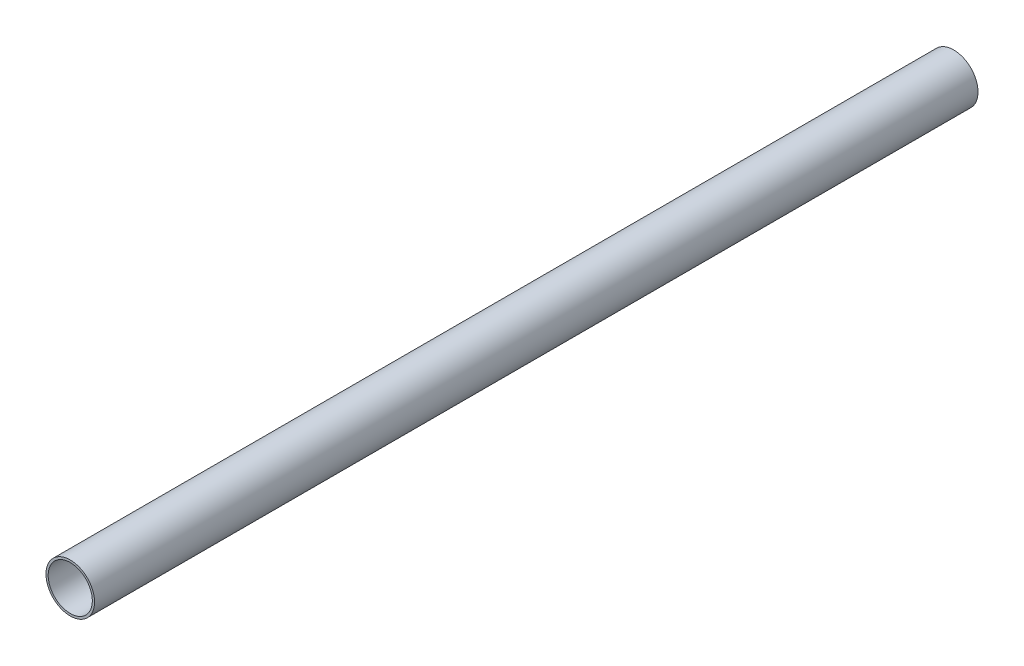
ISO-10303-21;
HEADER;
FILE_DESCRIPTION(('STEP AP214'),'2;1');
FILE_NAME('part.step','',(''),(''),'','','');
FILE_SCHEMA(('AUTOMOTIVE_DESIGN { 1 0 10303 214 1 1 1 1 }'));
ENDSEC;
DATA;
#1=APPLICATION_CONTEXT('core data for automotive mechanical design processes');
#2=APPLICATION_PROTOCOL_DEFINITION('international standard','automotive_design',2000,#1);
#3=PRODUCT_CONTEXT('',#1,'mechanical');
#4=PRODUCT('Part','Part','',(#3));
#5=PRODUCT_RELATED_PRODUCT_CATEGORY('part','',(#4));
#6=PRODUCT_DEFINITION_FORMATION('','',#4);
#7=PRODUCT_DEFINITION_CONTEXT('part definition',#1,'design');
#8=PRODUCT_DEFINITION('design','',#6,#7);
#9=PRODUCT_DEFINITION_SHAPE('','',#8);
#10=(LENGTH_UNIT() NAMED_UNIT(*) SI_UNIT(.MILLI.,.METRE.));
#11=(NAMED_UNIT(*) PLANE_ANGLE_UNIT() SI_UNIT($,.RADIAN.));
#12=(NAMED_UNIT(*) SI_UNIT($,.STERADIAN.) SOLID_ANGLE_UNIT());
#13=UNCERTAINTY_MEASURE_WITH_UNIT(LENGTH_MEASURE(1.E-05),#10,'distance_accuracy_value','');
#14=(GEOMETRIC_REPRESENTATION_CONTEXT(3) GLOBAL_UNCERTAINTY_ASSIGNED_CONTEXT((#13)) GLOBAL_UNIT_ASSIGNED_CONTEXT((#10,
#11,#12)) REPRESENTATION_CONTEXT('',''));
#15=CARTESIAN_POINT('',(0.,0.,0.));
#16=DIRECTION('',(0.,0.,1.));
#17=DIRECTION('',(1.,0.,0.));
#18=AXIS2_PLACEMENT_3D('',#15,#16,#17);
#19=CARTESIAN_POINT('',(0.,0.,690.));
#20=DIRECTION('',(0.,0.,-1.));
#21=DIRECTION('',(-1.,0.,0.));
#22=AXIS2_PLACEMENT_3D('',#19,#20,#21);
#23=CYLINDRICAL_SURFACE('',#22,18.975);
#24=CARTESIAN_POINT('',(0.,0.,690.));
#25=DIRECTION('',(0.,0.,1.));
#26=DIRECTION('',(1.,0.,0.));
#27=AXIS2_PLACEMENT_3D('',#24,#25,#26);
#28=CIRCLE('',#27,18.975);
#29=CARTESIAN_POINT('',(18.975,0.,690.));
#30=VERTEX_POINT('',#29);
#31=EDGE_CURVE('E10',#30,#30,#28,.T.);
#32=ORIENTED_EDGE('',*,*,#31,.F.);
#33=EDGE_LOOP('',(#32));
#34=FACE_BOUND('',#33,.T.);
#35=CARTESIAN_POINT('',(0.,0.,0.));
#36=DIRECTION('',(0.,0.,1.));
#37=DIRECTION('',(1.,0.,0.));
#38=AXIS2_PLACEMENT_3D('',#35,#36,#37);
#39=CIRCLE('',#38,18.975);
#40=CARTESIAN_POINT('',(18.975,0.,0.));
#41=VERTEX_POINT('',#40);
#42=EDGE_CURVE('E34',#41,#41,#39,.T.);
#43=ORIENTED_EDGE('',*,*,#42,.T.);
#44=EDGE_LOOP('',(#43));
#45=FACE_BOUND('',#44,.T.);
#46=ADVANCED_FACE('F31',(#34,#45),#23,.T.);
#47=CARTESIAN_POINT('',(0.,0.,690.));
#48=DIRECTION('',(0.,0.,1.));
#49=DIRECTION('',(1.,0.,0.));
#50=AXIS2_PLACEMENT_3D('',#47,#48,#49);
#51=PLANE('',#50);
#52=CARTESIAN_POINT('',(0.,0.,690.));
#53=DIRECTION('',(0.,0.,1.));
#54=DIRECTION('',(1.,0.,0.));
#55=AXIS2_PLACEMENT_3D('',#52,#53,#54);
#56=CIRCLE('',#55,17.25);
#57=CARTESIAN_POINT('',(17.25,0.,690.));
#58=VERTEX_POINT('',#57);
#59=EDGE_CURVE('E43',#58,#58,#56,.T.);
#60=ORIENTED_EDGE('',*,*,#59,.F.);
#61=EDGE_LOOP('',(#60));
#62=FACE_BOUND('',#61,.T.);
#63=ORIENTED_EDGE('',*,*,#31,.T.);
#64=EDGE_LOOP('',(#63));
#65=FACE_BOUND('',#64,.T.);
#66=ADVANCED_FACE('F58',(#62,#65),#51,.T.);
#67=CARTESIAN_POINT('',(0.,0.,0.));
#68=DIRECTION('',(0.,0.,1.));
#69=DIRECTION('',(1.,0.,0.));
#70=AXIS2_PLACEMENT_3D('',#67,#68,#69);
#71=PLANE('',#70);
#72=ORIENTED_EDGE('',*,*,#42,.F.);
#73=EDGE_LOOP('',(#72));
#74=FACE_BOUND('',#73,.T.);
#75=ADVANCED_FACE('F54',(#74),#71,.F.);
#76=CARTESIAN_POINT('',(0.,0.,34.5));
#77=DIRECTION('',(0.,0.,1.));
#78=DIRECTION('',(1.,0.,0.));
#79=AXIS2_PLACEMENT_3D('',#76,#77,#78);
#80=CYLINDRICAL_SURFACE('',#79,17.25);
#81=CARTESIAN_POINT('',(0.,0.,34.5));
#82=DIRECTION('',(0.,0.,1.));
#83=DIRECTION('',(1.,0.,0.));
#84=AXIS2_PLACEMENT_3D('',#81,#82,#83);
#85=CIRCLE('',#84,17.25);
#86=CARTESIAN_POINT('',(17.25,0.,34.5));
#87=VERTEX_POINT('',#86);
#88=EDGE_CURVE('E41',#87,#87,#85,.T.);
#89=CARTESIAN_POINT('',(17.25,0.,34.5));
#90=CARTESIAN_POINT('',(17.25,0.,41.328125));
#91=CARTESIAN_POINT('',(17.25,0.,48.15625));
#92=CARTESIAN_POINT('',(17.25,0.,61.8125));
#93=CARTESIAN_POINT('',(17.25,0.,68.640625));
#94=CARTESIAN_POINT('',(17.25,0.,82.296875));
#95=CARTESIAN_POINT('',(17.25,0.,89.125));
#96=CARTESIAN_POINT('',(17.25,0.,102.78125));
#97=CARTESIAN_POINT('',(17.25,0.,109.609375));
#98=CARTESIAN_POINT('',(17.25,0.,123.265625));
#99=CARTESIAN_POINT('',(17.25,0.,130.09375));
#100=CARTESIAN_POINT('',(17.25,0.,143.75));
#101=CARTESIAN_POINT('',(17.25,0.,150.578125));
#102=CARTESIAN_POINT('',(17.25,0.,164.234375));
#103=CARTESIAN_POINT('',(17.25,0.,171.0625));
#104=CARTESIAN_POINT('',(17.25,0.,184.71875));
#105=CARTESIAN_POINT('',(17.25,0.,191.546875));
#106=CARTESIAN_POINT('',(17.25,0.,205.203125));
#107=CARTESIAN_POINT('',(17.25,0.,212.03125));
#108=CARTESIAN_POINT('',(17.25,0.,225.6875));
#109=CARTESIAN_POINT('',(17.25,0.,232.515625));
#110=CARTESIAN_POINT('',(17.25,0.,246.171875));
#111=CARTESIAN_POINT('',(17.25,0.,253.));
#112=CARTESIAN_POINT('',(17.25,0.,266.65625));
#113=CARTESIAN_POINT('',(17.25,0.,273.484375));
#114=CARTESIAN_POINT('',(17.25,0.,287.140625));
#115=CARTESIAN_POINT('',(17.25,0.,293.96875));
#116=CARTESIAN_POINT('',(17.25,0.,307.625));
#117=CARTESIAN_POINT('',(17.25,0.,314.453125));
#118=CARTESIAN_POINT('',(17.25,0.,328.109375));
#119=CARTESIAN_POINT('',(17.25,0.,334.9375));
#120=CARTESIAN_POINT('',(17.25,0.,348.59375));
#121=CARTESIAN_POINT('',(17.25,0.,355.421875));
#122=CARTESIAN_POINT('',(17.25,0.,369.078125));
#123=CARTESIAN_POINT('',(17.25,0.,375.90625));
#124=CARTESIAN_POINT('',(17.25,0.,389.5625));
#125=CARTESIAN_POINT('',(17.25,0.,396.390625));
#126=CARTESIAN_POINT('',(17.25,0.,410.046875));
#127=CARTESIAN_POINT('',(17.25,0.,416.875));
#128=CARTESIAN_POINT('',(17.25,0.,430.53125));
#129=CARTESIAN_POINT('',(17.25,0.,437.359375));
#130=CARTESIAN_POINT('',(17.25,0.,451.015625));
#131=CARTESIAN_POINT('',(17.25,0.,457.84375));
#132=CARTESIAN_POINT('',(17.25,0.,471.5));
#133=CARTESIAN_POINT('',(17.25,0.,478.328125));
#134=CARTESIAN_POINT('',(17.25,0.,491.984375));
#135=CARTESIAN_POINT('',(17.25,0.,498.8125));
#136=CARTESIAN_POINT('',(17.25,0.,512.46875));
#137=CARTESIAN_POINT('',(17.25,0.,519.296875));
#138=CARTESIAN_POINT('',(17.25,0.,532.953125));
#139=CARTESIAN_POINT('',(17.25,0.,539.78125));
#140=CARTESIAN_POINT('',(17.25,0.,553.4375));
#141=CARTESIAN_POINT('',(17.25,0.,560.265625));
#142=CARTESIAN_POINT('',(17.25,0.,573.921875));
#143=CARTESIAN_POINT('',(17.25,0.,580.75));
#144=CARTESIAN_POINT('',(17.25,0.,594.40625));
#145=CARTESIAN_POINT('',(17.25,0.,601.234375));
#146=CARTESIAN_POINT('',(17.25,0.,614.890625));
#147=CARTESIAN_POINT('',(17.25,0.,621.71875));
#148=CARTESIAN_POINT('',(17.25,0.,635.375));
#149=CARTESIAN_POINT('',(17.25,0.,642.203125));
#150=CARTESIAN_POINT('',(17.25,0.,655.859375));
#151=CARTESIAN_POINT('',(17.25,0.,662.6875));
#152=CARTESIAN_POINT('',(17.25,0.,676.34375));
#153=CARTESIAN_POINT('',(17.25,0.,683.171875));
#154=CARTESIAN_POINT('',(17.25,0.,690.));
#155=B_SPLINE_CURVE_WITH_KNOTS('',3,(#89,#90,#91,#92,#93,#94,#95,#96,#97,#98,#99,#100,#101,#102,
#103,#104,#105,#106,#107,#108,#109,#110,#111,#112,#113,#114,#115,#116,#117,#118,#119,#120,#121,
#122,#123,#124,#125,#126,#127,#128,#129,#130,#131,#132,#133,#134,#135,#136,#137,#138,#139,#140,
#141,#142,#143,#144,#145,#146,#147,#148,#149,#150,#151,#152,#153,#154),.UNSPECIFIED.,.F.,.F.,(4,
2,2,2,2,2,2,2,2,2,2,2,2,2,2,2,2,2,2,2,2,2,2,2,2,2,2,2,2,2,2,2,4),(0.,20.484375,40.96875,
61.453125,81.9375,102.421875,122.90625,143.390625,163.875,184.359375,204.84375,225.328125,
245.8125,266.296875,286.78125,307.265625,327.75,348.234375,368.71875,389.203125,409.6875,
430.171875,450.65625,471.140625,491.625,512.109375,532.59375,553.078125,573.5625,594.046875,
614.53125,635.015625,655.5),.UNSPECIFIED.);
#156=EDGE_CURVE('BSEAM51',#87,#58,#155,.T.);
#157=ORIENTED_EDGE('',*,*,#88,.F.);
#158=ORIENTED_EDGE('',*,*,#59,.T.);
#159=ORIENTED_EDGE('',*,*,#156,.T.);
#160=ORIENTED_EDGE('',*,*,#156,.F.);
#161=EDGE_LOOP('',(#157,#159,#158,#160));
#162=FACE_BOUND('',#161,.T.);
#163=ADVANCED_FACE('F51',(#162),#80,.F.);
#164=CARTESIAN_POINT('',(0.,0.,34.5));
#165=DIRECTION('',(0.,0.,1.));
#166=DIRECTION('',(1.,0.,0.));
#167=AXIS2_PLACEMENT_3D('',#164,#165,#166);
#168=PLANE('',#167);
#169=ORIENTED_EDGE('',*,*,#88,.T.);
#170=EDGE_LOOP('',(#169));
#171=FACE_BOUND('',#170,.T.);
#172=ADVANCED_FACE('F49',(#171),#168,.T.);
#173=CLOSED_SHELL('',(#46,#66,#75,#163,#172));
#174=MANIFOLD_SOLID_BREP('B2',#173);
#175=ADVANCED_BREP_SHAPE_REPRESENTATION('',(#18,#174),#14);
#176=SHAPE_DEFINITION_REPRESENTATION(#9,#175);
ENDSEC;
END-ISO-10303-21;
